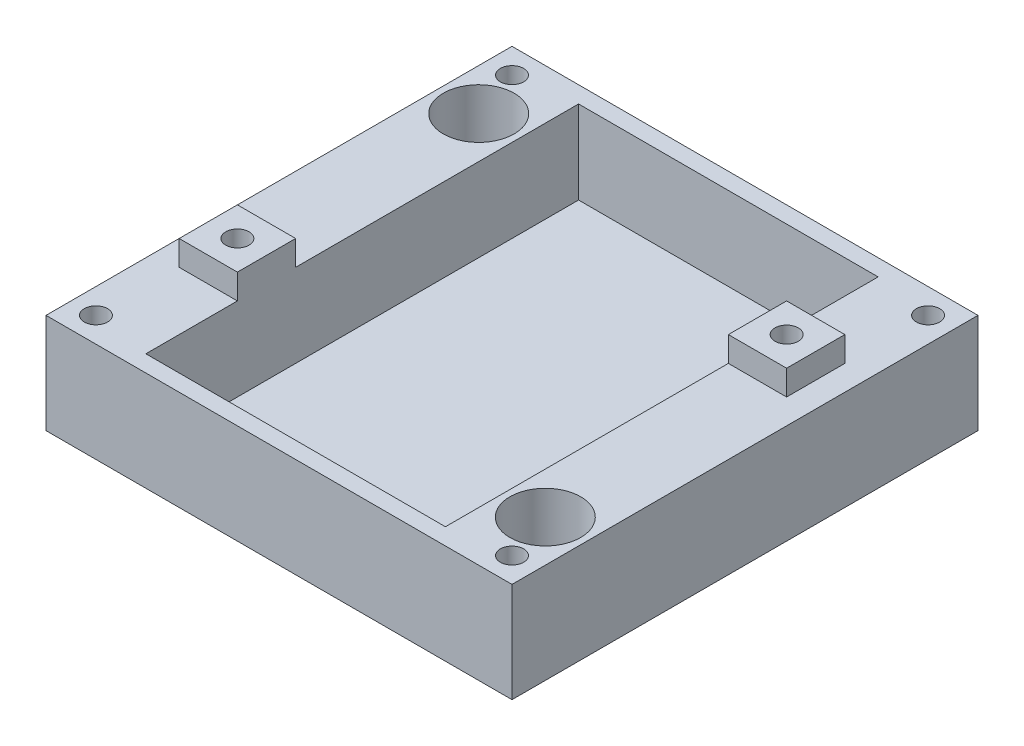
ISO-10303-21;
HEADER;
FILE_DESCRIPTION(('STEP AP214'),'2;1');
FILE_NAME('part.step','',(''),(''),'','','');
FILE_SCHEMA(('AUTOMOTIVE_DESIGN { 1 0 10303 214 1 1 1 1 }'));
ENDSEC;
DATA;
#1=APPLICATION_CONTEXT('core data for automotive mechanical design processes');
#2=APPLICATION_PROTOCOL_DEFINITION('international standard','automotive_design',2000,#1);
#3=PRODUCT_CONTEXT('',#1,'mechanical');
#4=PRODUCT('Part','Part','',(#3));
#5=PRODUCT_RELATED_PRODUCT_CATEGORY('part','',(#4));
#6=PRODUCT_DEFINITION_FORMATION('','',#4);
#7=PRODUCT_DEFINITION_CONTEXT('part definition',#1,'design');
#8=PRODUCT_DEFINITION('design','',#6,#7);
#9=PRODUCT_DEFINITION_SHAPE('','',#8);
#10=(LENGTH_UNIT() NAMED_UNIT(*) SI_UNIT(.MILLI.,.METRE.));
#11=(NAMED_UNIT(*) PLANE_ANGLE_UNIT() SI_UNIT($,.RADIAN.));
#12=(NAMED_UNIT(*) SI_UNIT($,.STERADIAN.) SOLID_ANGLE_UNIT());
#13=UNCERTAINTY_MEASURE_WITH_UNIT(LENGTH_MEASURE(1.E-05),#10,'distance_accuracy_value','');
#14=(GEOMETRIC_REPRESENTATION_CONTEXT(3) GLOBAL_UNCERTAINTY_ASSIGNED_CONTEXT((#13)) GLOBAL_UNIT_ASSIGNED_CONTEXT((#10,
#11,#12)) REPRESENTATION_CONTEXT('',''));
#15=CARTESIAN_POINT('',(0.,0.,0.));
#16=DIRECTION('',(0.,0.,1.));
#17=DIRECTION('',(1.,0.,0.));
#18=AXIS2_PLACEMENT_3D('',#15,#16,#17);
#19=CARTESIAN_POINT('',(23.,0.,19.));
#20=DIRECTION('',(0.,1.,0.));
#21=DIRECTION('',(0.,0.,1.));
#22=AXIS2_PLACEMENT_3D('',#19,#20,#21);
#23=CYLINDRICAL_SURFACE('',#22,2.25);
#24=CARTESIAN_POINT('',(23.,1.49999999999999,19.));
#25=DIRECTION('',(0.,1.,0.));
#26=DIRECTION('',(0.,0.,1.));
#27=AXIS2_PLACEMENT_3D('',#24,#25,#26);
#28=CIRCLE('',#27,2.25);
#29=CARTESIAN_POINT('',(23.,1.49999999999999,21.25));
#30=VERTEX_POINT('',#29);
#31=EDGE_CURVE('E43',#30,#30,#28,.T.);
#32=ORIENTED_EDGE('',*,*,#31,.T.);
#33=EDGE_LOOP('',(#32));
#34=FACE_BOUND('',#33,.T.);
#35=CARTESIAN_POINT('',(23.,0.,19.));
#36=DIRECTION('',(0.,1.,0.));
#37=DIRECTION('',(0.,0.,1.));
#38=AXIS2_PLACEMENT_3D('',#35,#36,#37);
#39=CIRCLE('',#38,2.25);
#40=CARTESIAN_POINT('',(23.,0.,21.25));
#41=VERTEX_POINT('',#40);
#42=EDGE_CURVE('E295',#41,#41,#39,.T.);
#43=ORIENTED_EDGE('',*,*,#42,.F.);
#44=EDGE_LOOP('',(#43));
#45=FACE_BOUND('',#44,.T.);
#46=ADVANCED_FACE('F35',(#34,#45),#23,.F.);
#47=CARTESIAN_POINT('',(-23.,0.,-19.));
#48=DIRECTION('',(0.,1.,0.));
#49=DIRECTION('',(0.,0.,1.));
#50=AXIS2_PLACEMENT_3D('',#47,#48,#49);
#51=CYLINDRICAL_SURFACE('',#50,2.25);
#52=CARTESIAN_POINT('',(-23.,1.49999999999999,-19.));
#53=DIRECTION('',(0.,1.,0.));
#54=DIRECTION('',(0.,0.,1.));
#55=AXIS2_PLACEMENT_3D('',#52,#53,#54);
#56=CIRCLE('',#55,2.25);
#57=CARTESIAN_POINT('',(-23.,1.49999999999999,-16.75));
#58=VERTEX_POINT('',#57);
#59=EDGE_CURVE('E11',#58,#58,#56,.T.);
#60=ORIENTED_EDGE('',*,*,#59,.T.);
#61=EDGE_LOOP('',(#60));
#62=FACE_BOUND('',#61,.T.);
#63=CARTESIAN_POINT('',(-23.,0.,-19.));
#64=DIRECTION('',(0.,1.,0.));
#65=DIRECTION('',(0.,0.,1.));
#66=AXIS2_PLACEMENT_3D('',#63,#64,#65);
#67=CIRCLE('',#66,2.25);
#68=CARTESIAN_POINT('',(-23.,0.,-16.75));
#69=VERTEX_POINT('',#68);
#70=EDGE_CURVE('E291',#69,#69,#67,.T.);
#71=ORIENTED_EDGE('',*,*,#70,.F.);
#72=EDGE_LOOP('',(#71));
#73=FACE_BOUND('',#72,.T.);
#74=ADVANCED_FACE('F359',(#62,#73),#51,.F.);
#75=CARTESIAN_POINT('',(0.,12.,0.));
#76=DIRECTION('',(0.,1.,0.));
#77=DIRECTION('',(0.,0.,1.));
#78=AXIS2_PLACEMENT_3D('',#75,#76,#77);
#79=PLANE('',#78);
#80=CARTESIAN_POINT('',(25.,12.,-25.));
#81=DIRECTION('',(0.,1.,0.));
#82=DIRECTION('',(0.,0.,1.));
#83=AXIS2_PLACEMENT_3D('',#80,#81,#82);
#84=CIRCLE('',#83,1.4);
#85=CARTESIAN_POINT('',(25.,12.,-23.6));
#86=VERTEX_POINT('',#85);
#87=EDGE_CURVE('E586',#86,#86,#84,.T.);
#88=ORIENTED_EDGE('',*,*,#87,.F.);
#89=EDGE_LOOP('',(#88));
#90=FACE_BOUND('',#89,.T.);
#91=CARTESIAN_POINT('',(-25.,12.,25.));
#92=DIRECTION('',(0.,1.,0.));
#93=DIRECTION('',(0.,0.,1.));
#94=AXIS2_PLACEMENT_3D('',#91,#92,#93);
#95=CIRCLE('',#94,1.4);
#96=CARTESIAN_POINT('',(-25.,12.,26.4));
#97=VERTEX_POINT('',#96);
#98=EDGE_CURVE('E585',#97,#97,#95,.T.);
#99=ORIENTED_EDGE('',*,*,#98,.F.);
#100=EDGE_LOOP('',(#99));
#101=FACE_BOUND('',#100,.T.);
#102=CARTESIAN_POINT('',(25.,12.,25.));
#103=DIRECTION('',(0.,1.,0.));
#104=DIRECTION('',(0.,0.,1.));
#105=AXIS2_PLACEMENT_3D('',#102,#103,#104);
#106=CIRCLE('',#105,1.4);
#107=CARTESIAN_POINT('',(25.,12.,26.4));
#108=VERTEX_POINT('',#107);
#109=EDGE_CURVE('E737',#108,#108,#106,.T.);
#110=ORIENTED_EDGE('',*,*,#109,.F.);
#111=EDGE_LOOP('',(#110));
#112=FACE_BOUND('',#111,.T.);
#113=CARTESIAN_POINT('',(-25.,12.,-25.));
#114=DIRECTION('',(0.,1.,0.));
#115=DIRECTION('',(0.,0.,1.));
#116=AXIS2_PLACEMENT_3D('',#113,#114,#115);
#117=CIRCLE('',#116,1.4);
#118=CARTESIAN_POINT('',(-25.,12.,-23.6));
#119=VERTEX_POINT('',#118);
#120=EDGE_CURVE('E597',#119,#119,#117,.T.);
#121=ORIENTED_EDGE('',*,*,#120,.F.);
#122=EDGE_LOOP('',(#121));
#123=FACE_BOUND('',#122,.T.);
#124=CARTESIAN_POINT('',(-23.,12.,-19.));
#125=DIRECTION('',(0.,1.,0.));
#126=DIRECTION('',(0.,0.,1.));
#127=AXIS2_PLACEMENT_3D('',#124,#125,#126);
#128=CIRCLE('',#127,4.25);
#129=CARTESIAN_POINT('',(-23.,12.,-14.75));
#130=VERTEX_POINT('',#129);
#131=EDGE_CURVE('E280',#130,#130,#128,.T.);
#132=ORIENTED_EDGE('',*,*,#131,.F.);
#133=EDGE_LOOP('',(#132));
#134=FACE_BOUND('',#133,.T.);
#135=CARTESIAN_POINT('',(23.,12.,19.));
#136=DIRECTION('',(0.,1.,0.));
#137=DIRECTION('',(0.,0.,1.));
#138=AXIS2_PLACEMENT_3D('',#135,#136,#137);
#139=CIRCLE('',#138,4.25);
#140=CARTESIAN_POINT('',(23.,12.,23.25));
#141=VERTEX_POINT('',#140);
#142=EDGE_CURVE('E281',#141,#141,#139,.T.);
#143=ORIENTED_EDGE('',*,*,#142,.F.);
#144=EDGE_LOOP('',(#143));
#145=FACE_BOUND('',#144,.T.);
#146=DIRECTION('',(0.,0.,1.));
#147=VECTOR('',#146,1.);
#148=CARTESIAN_POINT('',(-28.,12.,28.));
#149=LINE('',#148,#147);
#150=CARTESIAN_POINT('',(-28.,12.,-28.));
#151=VERTEX_POINT('',#150);
#152=CARTESIAN_POINT('',(-28.,12.,28.));
#153=VERTEX_POINT('',#152);
#154=EDGE_CURVE('E239',#151,#153,#149,.T.);
#155=ORIENTED_EDGE('',*,*,#154,.T.);
#156=DIRECTION('',(1.,0.,0.));
#157=VECTOR('',#156,1.);
#158=CARTESIAN_POINT('',(28.,12.,28.));
#159=LINE('',#158,#157);
#160=CARTESIAN_POINT('',(28.,12.,28.));
#161=VERTEX_POINT('',#160);
#162=EDGE_CURVE('E242',#153,#161,#159,.T.);
#163=ORIENTED_EDGE('',*,*,#162,.T.);
#164=DIRECTION('',(0.,0.,-1.));
#165=VECTOR('',#164,1.);
#166=CARTESIAN_POINT('',(28.,12.,28.));
#167=LINE('',#166,#165);
#168=CARTESIAN_POINT('',(28.,12.,-28.));
#169=VERTEX_POINT('',#168);
#170=EDGE_CURVE('E245',#161,#169,#167,.T.);
#171=ORIENTED_EDGE('',*,*,#170,.T.);
#172=DIRECTION('',(-1.,0.,0.));
#173=VECTOR('',#172,1.);
#174=CARTESIAN_POINT('',(28.,12.,-28.));
#175=LINE('',#174,#173);
#176=EDGE_CURVE('E247',#169,#151,#175,.T.);
#177=ORIENTED_EDGE('',*,*,#176,.T.);
#178=EDGE_LOOP('',(#155,#163,#171,#177));
#179=FACE_BOUND('',#178,.T.);
#180=DIRECTION('',(0.,0.,-1.));
#181=VECTOR('',#180,1.);
#182=CARTESIAN_POINT('',(18.,12.,-26.));
#183=LINE('',#182,#181);
#184=CARTESIAN_POINT('',(18.,12.,-15.));
#185=VERTEX_POINT('',#184);
#186=CARTESIAN_POINT('',(18.,12.,-26.));
#187=VERTEX_POINT('',#186);
#188=EDGE_CURVE('E202',#185,#187,#183,.T.);
#189=ORIENTED_EDGE('',*,*,#188,.F.);
#190=DIRECTION('',(-1.,0.,0.));
#191=VECTOR('',#190,1.);
#192=CARTESIAN_POINT('',(18.,12.,-15.));
#193=LINE('',#192,#191);
#194=CARTESIAN_POINT('',(25.,12.,-15.));
#195=VERTEX_POINT('',#194);
#196=EDGE_CURVE('E313',#195,#185,#193,.T.);
#197=ORIENTED_EDGE('',*,*,#196,.F.);
#198=DIRECTION('',(0.,0.,-1.));
#199=VECTOR('',#198,1.);
#200=CARTESIAN_POINT('',(25.,12.,-15.));
#201=LINE('',#200,#199);
#202=CARTESIAN_POINT('',(25.,12.,-8.));
#203=VERTEX_POINT('',#202);
#204=EDGE_CURVE('E168',#203,#195,#201,.T.);
#205=ORIENTED_EDGE('',*,*,#204,.F.);
#206=DIRECTION('',(1.,0.,0.));
#207=VECTOR('',#206,1.);
#208=CARTESIAN_POINT('',(18.,12.,-8.));
#209=LINE('',#208,#207);
#210=CARTESIAN_POINT('',(18.,12.,-8.));
#211=VERTEX_POINT('',#210);
#212=EDGE_CURVE('E164',#211,#203,#209,.T.);
#213=ORIENTED_EDGE('',*,*,#212,.F.);
#214=CARTESIAN_POINT('',(18.,12.,26.));
#215=VERTEX_POINT('',#214);
#216=EDGE_CURVE('E217',#215,#211,#183,.T.);
#217=ORIENTED_EDGE('',*,*,#216,.F.);
#218=DIRECTION('',(1.,0.,0.));
#219=VECTOR('',#218,1.);
#220=CARTESIAN_POINT('',(-18.,12.,26.));
#221=LINE('',#220,#219);
#222=CARTESIAN_POINT('',(-18.,12.,26.));
#223=VERTEX_POINT('',#222);
#224=EDGE_CURVE('E207',#223,#215,#221,.T.);
#225=ORIENTED_EDGE('',*,*,#224,.F.);
#226=DIRECTION('',(0.,0.,1.));
#227=VECTOR('',#226,1.);
#228=CARTESIAN_POINT('',(-18.,12.,-26.));
#229=LINE('',#228,#227);
#230=CARTESIAN_POINT('',(-18.,12.,15.));
#231=VERTEX_POINT('',#230);
#232=EDGE_CURVE('E223',#231,#223,#229,.T.);
#233=ORIENTED_EDGE('',*,*,#232,.F.);
#234=DIRECTION('',(1.,0.,0.));
#235=VECTOR('',#234,1.);
#236=CARTESIAN_POINT('',(-25.,12.,15.));
#237=LINE('',#236,#235);
#238=CARTESIAN_POINT('',(-25.,12.,15.));
#239=VERTEX_POINT('',#238);
#240=EDGE_CURVE('E58',#239,#231,#237,.T.);
#241=ORIENTED_EDGE('',*,*,#240,.F.);
#242=DIRECTION('',(0.,0.,1.));
#243=VECTOR('',#242,1.);
#244=CARTESIAN_POINT('',(-25.,12.,8.00000000000001));
#245=LINE('',#244,#243);
#246=CARTESIAN_POINT('',(-25.,12.,8.00000000000001));
#247=VERTEX_POINT('',#246);
#248=EDGE_CURVE('E173',#247,#239,#245,.T.);
#249=ORIENTED_EDGE('',*,*,#248,.F.);
#250=DIRECTION('',(-1.,0.,0.));
#251=VECTOR('',#250,1.);
#252=CARTESIAN_POINT('',(-25.,12.,8.00000000000001));
#253=LINE('',#252,#251);
#254=CARTESIAN_POINT('',(-18.,12.,7.99999999999999));
#255=VERTEX_POINT('',#254);
#256=EDGE_CURVE('E170',#255,#247,#253,.T.);
#257=ORIENTED_EDGE('',*,*,#256,.F.);
#258=CARTESIAN_POINT('',(-18.,12.,-26.));
#259=VERTEX_POINT('',#258);
#260=EDGE_CURVE('E224',#259,#255,#229,.T.);
#261=ORIENTED_EDGE('',*,*,#260,.F.);
#262=DIRECTION('',(-1.,0.,0.));
#263=VECTOR('',#262,1.);
#264=CARTESIAN_POINT('',(-18.,12.,-26.));
#265=LINE('',#264,#263);
#266=EDGE_CURVE('E220',#187,#259,#265,.T.);
#267=ORIENTED_EDGE('',*,*,#266,.F.);
#268=EDGE_LOOP('',(#189,#197,#205,#213,#217,#225,#233,#241,#249,#257,#261,#267));
#269=FACE_BOUND('',#268,.T.);
#270=ADVANCED_FACE('F322',(#90,#101,#112,#123,#134,#145,#179,#269),#79,.T.);
#271=CARTESIAN_POINT('',(-28.,12.,28.));
#272=DIRECTION('',(1.,0.,0.));
#273=DIRECTION('',(0.,0.,-1.));
#274=AXIS2_PLACEMENT_3D('',#271,#272,#273);
#275=PLANE('',#274);
#276=DIRECTION('',(0.,0.,1.));
#277=VECTOR('',#276,1.);
#278=CARTESIAN_POINT('',(-28.,0.,28.));
#279=LINE('',#278,#277);
#280=CARTESIAN_POINT('',(-28.,0.,-28.));
#281=VERTEX_POINT('',#280);
#282=CARTESIAN_POINT('',(-28.,0.,28.));
#283=VERTEX_POINT('',#282);
#284=EDGE_CURVE('E231',#281,#283,#279,.T.);
#285=ORIENTED_EDGE('',*,*,#284,.T.);
#286=DIRECTION('',(0.,-1.,0.));
#287=VECTOR('',#286,1.);
#288=CARTESIAN_POINT('',(-28.,12.,28.));
#289=LINE('',#288,#287);
#290=EDGE_CURVE('E265',#153,#283,#289,.T.);
#291=ORIENTED_EDGE('',*,*,#290,.F.);
#292=ORIENTED_EDGE('',*,*,#154,.F.);
#293=DIRECTION('',(0.,-1.,0.));
#294=VECTOR('',#293,1.);
#295=CARTESIAN_POINT('',(-28.,12.,-28.));
#296=LINE('',#295,#294);
#297=EDGE_CURVE('E249',#151,#281,#296,.T.);
#298=ORIENTED_EDGE('',*,*,#297,.T.);
#299=EDGE_LOOP('',(#285,#291,#292,#298));
#300=FACE_BOUND('',#299,.T.);
#301=ADVANCED_FACE('F500',(#300),#275,.F.);
#302=CARTESIAN_POINT('',(28.,12.,28.));
#303=DIRECTION('',(0.,0.,-1.));
#304=DIRECTION('',(-1.,0.,0.));
#305=AXIS2_PLACEMENT_3D('',#302,#303,#304);
#306=PLANE('',#305);
#307=DIRECTION('',(1.,0.,0.));
#308=VECTOR('',#307,1.);
#309=CARTESIAN_POINT('',(28.,0.,28.));
#310=LINE('',#309,#308);
#311=CARTESIAN_POINT('',(28.,0.,28.));
#312=VERTEX_POINT('',#311);
#313=EDGE_CURVE('E252',#283,#312,#310,.T.);
#314=ORIENTED_EDGE('',*,*,#313,.T.);
#315=DIRECTION('',(0.,-1.,0.));
#316=VECTOR('',#315,1.);
#317=CARTESIAN_POINT('',(28.,12.,28.));
#318=LINE('',#317,#316);
#319=EDGE_CURVE('E262',#161,#312,#318,.T.);
#320=ORIENTED_EDGE('',*,*,#319,.F.);
#321=ORIENTED_EDGE('',*,*,#162,.F.);
#322=ORIENTED_EDGE('',*,*,#290,.T.);
#323=EDGE_LOOP('',(#314,#320,#321,#322));
#324=FACE_BOUND('',#323,.T.);
#325=ADVANCED_FACE('F617',(#324),#306,.F.);
#326=CARTESIAN_POINT('',(28.,12.,28.));
#327=DIRECTION('',(-1.,0.,0.));
#328=DIRECTION('',(0.,0.,1.));
#329=AXIS2_PLACEMENT_3D('',#326,#327,#328);
#330=PLANE('',#329);
#331=DIRECTION('',(0.,0.,-1.));
#332=VECTOR('',#331,1.);
#333=CARTESIAN_POINT('',(28.,0.,28.));
#334=LINE('',#333,#332);
#335=CARTESIAN_POINT('',(28.,0.,-28.));
#336=VERTEX_POINT('',#335);
#337=EDGE_CURVE('E254',#312,#336,#334,.T.);
#338=ORIENTED_EDGE('',*,*,#337,.T.);
#339=DIRECTION('',(0.,-1.,0.));
#340=VECTOR('',#339,1.);
#341=CARTESIAN_POINT('',(28.,12.,-28.));
#342=LINE('',#341,#340);
#343=EDGE_CURVE('E259',#169,#336,#342,.T.);
#344=ORIENTED_EDGE('',*,*,#343,.F.);
#345=ORIENTED_EDGE('',*,*,#170,.F.);
#346=ORIENTED_EDGE('',*,*,#319,.T.);
#347=EDGE_LOOP('',(#338,#344,#345,#346));
#348=FACE_BOUND('',#347,.T.);
#349=ADVANCED_FACE('F622',(#348),#330,.F.);
#350=CARTESIAN_POINT('',(28.,12.,-28.));
#351=DIRECTION('',(0.,0.,1.));
#352=DIRECTION('',(1.,0.,0.));
#353=AXIS2_PLACEMENT_3D('',#350,#351,#352);
#354=PLANE('',#353);
#355=DIRECTION('',(-1.,0.,0.));
#356=VECTOR('',#355,1.);
#357=CARTESIAN_POINT('',(28.,0.,-28.));
#358=LINE('',#357,#356);
#359=EDGE_CURVE('E243',#336,#281,#358,.T.);
#360=ORIENTED_EDGE('',*,*,#359,.T.);
#361=ORIENTED_EDGE('',*,*,#297,.F.);
#362=ORIENTED_EDGE('',*,*,#176,.F.);
#363=ORIENTED_EDGE('',*,*,#343,.T.);
#364=EDGE_LOOP('',(#360,#361,#362,#363));
#365=FACE_BOUND('',#364,.T.);
#366=ADVANCED_FACE('F448',(#365),#354,.F.);
#367=CARTESIAN_POINT('',(0.,0.,0.));
#368=DIRECTION('',(0.,1.,0.));
#369=DIRECTION('',(0.,0.,1.));
#370=AXIS2_PLACEMENT_3D('',#367,#368,#369);
#371=PLANE('',#370);
#372=ORIENTED_EDGE('',*,*,#70,.T.);
#373=EDGE_LOOP('',(#372));
#374=FACE_BOUND('',#373,.T.);
#375=ORIENTED_EDGE('',*,*,#42,.T.);
#376=EDGE_LOOP('',(#375));
#377=FACE_BOUND('',#376,.T.);
#378=ORIENTED_EDGE('',*,*,#284,.F.);
#379=ORIENTED_EDGE('',*,*,#359,.F.);
#380=ORIENTED_EDGE('',*,*,#337,.F.);
#381=ORIENTED_EDGE('',*,*,#313,.F.);
#382=EDGE_LOOP('',(#378,#379,#380,#381));
#383=FACE_BOUND('',#382,.T.);
#384=ADVANCED_FACE('F444',(#374,#377,#383),#371,.F.);
#385=CARTESIAN_POINT('',(18.,2.,-26.));
#386=DIRECTION('',(1.,0.,0.));
#387=DIRECTION('',(0.,0.,-1.));
#388=AXIS2_PLACEMENT_3D('',#385,#386,#387);
#389=PLANE('',#388);
#390=ORIENTED_EDGE('',*,*,#216,.T.);
#391=DIRECTION('',(0.,-1.,0.));
#392=VECTOR('',#391,1.);
#393=CARTESIAN_POINT('',(18.,15.,-8.));
#394=LINE('',#393,#392);
#395=CARTESIAN_POINT('',(18.,15.,-8.));
#396=VERTEX_POINT('',#395);
#397=EDGE_CURVE('E175',#396,#211,#394,.T.);
#398=ORIENTED_EDGE('',*,*,#397,.F.);
#399=DIRECTION('',(0.,0.,1.));
#400=VECTOR('',#399,1.);
#401=CARTESIAN_POINT('',(18.,15.,-15.));
#402=LINE('',#401,#400);
#403=CARTESIAN_POINT('',(18.,15.,-15.));
#404=VERTEX_POINT('',#403);
#405=EDGE_CURVE('E154',#404,#396,#402,.T.);
#406=ORIENTED_EDGE('',*,*,#405,.F.);
#407=DIRECTION('',(0.,-1.,0.));
#408=VECTOR('',#407,1.);
#409=CARTESIAN_POINT('',(18.,15.,-15.));
#410=LINE('',#409,#408);
#411=EDGE_CURVE('E50',#404,#185,#410,.T.);
#412=ORIENTED_EDGE('',*,*,#411,.T.);
#413=ORIENTED_EDGE('',*,*,#188,.T.);
#414=DIRECTION('',(0.,1.,0.));
#415=VECTOR('',#414,1.);
#416=CARTESIAN_POINT('',(18.,2.,-26.));
#417=LINE('',#416,#415);
#418=CARTESIAN_POINT('',(18.,2.,-26.));
#419=VERTEX_POINT('',#418);
#420=EDGE_CURVE('E216',#419,#187,#417,.T.);
#421=ORIENTED_EDGE('',*,*,#420,.F.);
#422=DIRECTION('',(0.,0.,-1.));
#423=VECTOR('',#422,1.);
#424=CARTESIAN_POINT('',(18.,2.,-26.));
#425=LINE('',#424,#423);
#426=CARTESIAN_POINT('',(18.,2.,26.));
#427=VERTEX_POINT('',#426);
#428=EDGE_CURVE('E203',#427,#419,#425,.T.);
#429=ORIENTED_EDGE('',*,*,#428,.F.);
#430=DIRECTION('',(0.,1.,0.));
#431=VECTOR('',#430,1.);
#432=CARTESIAN_POINT('',(18.,2.,26.));
#433=LINE('',#432,#431);
#434=EDGE_CURVE('E229',#427,#215,#433,.T.);
#435=ORIENTED_EDGE('',*,*,#434,.T.);
#436=EDGE_LOOP('',(#390,#398,#406,#412,#413,#421,#429,#435));
#437=FACE_BOUND('',#436,.T.);
#438=ADVANCED_FACE('F324',(#437),#389,.F.);
#439=CARTESIAN_POINT('',(-18.,2.,26.));
#440=DIRECTION('',(0.,0.,1.));
#441=DIRECTION('',(1.,0.,0.));
#442=AXIS2_PLACEMENT_3D('',#439,#440,#441);
#443=PLANE('',#442);
#444=ORIENTED_EDGE('',*,*,#224,.T.);
#445=ORIENTED_EDGE('',*,*,#434,.F.);
#446=DIRECTION('',(1.,0.,0.));
#447=VECTOR('',#446,1.);
#448=CARTESIAN_POINT('',(-18.,2.,26.));
#449=LINE('',#448,#447);
#450=CARTESIAN_POINT('',(-18.,2.,26.));
#451=VERTEX_POINT('',#450);
#452=EDGE_CURVE('E213',#451,#427,#449,.T.);
#453=ORIENTED_EDGE('',*,*,#452,.F.);
#454=DIRECTION('',(0.,1.,0.));
#455=VECTOR('',#454,1.);
#456=CARTESIAN_POINT('',(-18.,2.,26.));
#457=LINE('',#456,#455);
#458=EDGE_CURVE('E232',#451,#223,#457,.T.);
#459=ORIENTED_EDGE('',*,*,#458,.T.);
#460=EDGE_LOOP('',(#444,#445,#453,#459));
#461=FACE_BOUND('',#460,.T.);
#462=ADVANCED_FACE('F328',(#461),#443,.F.);
#463=CARTESIAN_POINT('',(-18.,2.,-26.));
#464=DIRECTION('',(-1.,0.,0.));
#465=DIRECTION('',(0.,0.,1.));
#466=AXIS2_PLACEMENT_3D('',#463,#464,#465);
#467=PLANE('',#466);
#468=ORIENTED_EDGE('',*,*,#260,.T.);
#469=DIRECTION('',(0.,-1.,0.));
#470=VECTOR('',#469,1.);
#471=CARTESIAN_POINT('',(-18.,15.,8.));
#472=LINE('',#471,#470);
#473=CARTESIAN_POINT('',(-18.,15.,8.));
#474=VERTEX_POINT('',#473);
#475=EDGE_CURVE('E199',#474,#255,#472,.T.);
#476=ORIENTED_EDGE('',*,*,#475,.F.);
#477=DIRECTION('',(0.,0.,-1.));
#478=VECTOR('',#477,1.);
#479=CARTESIAN_POINT('',(-18.,15.,8.));
#480=LINE('',#479,#478);
#481=CARTESIAN_POINT('',(-18.,15.,15.));
#482=VERTEX_POINT('',#481);
#483=EDGE_CURVE('E179',#482,#474,#480,.T.);
#484=ORIENTED_EDGE('',*,*,#483,.F.);
#485=DIRECTION('',(0.,-1.,0.));
#486=VECTOR('',#485,1.);
#487=CARTESIAN_POINT('',(-18.,15.,15.));
#488=LINE('',#487,#486);
#489=EDGE_CURVE('E187',#482,#231,#488,.T.);
#490=ORIENTED_EDGE('',*,*,#489,.T.);
#491=ORIENTED_EDGE('',*,*,#232,.T.);
#492=ORIENTED_EDGE('',*,*,#458,.F.);
#493=DIRECTION('',(0.,0.,1.));
#494=VECTOR('',#493,1.);
#495=CARTESIAN_POINT('',(-18.,2.,-26.));
#496=LINE('',#495,#494);
#497=CARTESIAN_POINT('',(-18.,2.,-26.));
#498=VERTEX_POINT('',#497);
#499=EDGE_CURVE('E210',#498,#451,#496,.T.);
#500=ORIENTED_EDGE('',*,*,#499,.F.);
#501=DIRECTION('',(0.,1.,0.));
#502=VECTOR('',#501,1.);
#503=CARTESIAN_POINT('',(-18.,2.,-26.));
#504=LINE('',#503,#502);
#505=EDGE_CURVE('E235',#498,#259,#504,.T.);
#506=ORIENTED_EDGE('',*,*,#505,.T.);
#507=EDGE_LOOP('',(#468,#476,#484,#490,#491,#492,#500,#506));
#508=FACE_BOUND('',#507,.T.);
#509=ADVANCED_FACE('F336',(#508),#467,.F.);
#510=CARTESIAN_POINT('',(-18.,2.,-26.));
#511=DIRECTION('',(0.,0.,-1.));
#512=DIRECTION('',(-1.,0.,0.));
#513=AXIS2_PLACEMENT_3D('',#510,#511,#512);
#514=PLANE('',#513);
#515=ORIENTED_EDGE('',*,*,#266,.T.);
#516=ORIENTED_EDGE('',*,*,#505,.F.);
#517=DIRECTION('',(-1.,0.,0.));
#518=VECTOR('',#517,1.);
#519=CARTESIAN_POINT('',(-18.,2.,-26.));
#520=LINE('',#519,#518);
#521=EDGE_CURVE('E206',#419,#498,#520,.T.);
#522=ORIENTED_EDGE('',*,*,#521,.F.);
#523=ORIENTED_EDGE('',*,*,#420,.T.);
#524=EDGE_LOOP('',(#515,#516,#522,#523));
#525=FACE_BOUND('',#524,.T.);
#526=ADVANCED_FACE('F355',(#525),#514,.F.);
#527=CARTESIAN_POINT('',(0.,2.,0.));
#528=DIRECTION('',(0.,1.,0.));
#529=DIRECTION('',(0.,0.,1.));
#530=AXIS2_PLACEMENT_3D('',#527,#528,#529);
#531=PLANE('',#530);
#532=ORIENTED_EDGE('',*,*,#428,.T.);
#533=ORIENTED_EDGE('',*,*,#521,.T.);
#534=ORIENTED_EDGE('',*,*,#499,.T.);
#535=ORIENTED_EDGE('',*,*,#452,.T.);
#536=EDGE_LOOP('',(#532,#533,#534,#535));
#537=FACE_BOUND('',#536,.T.);
#538=ADVANCED_FACE('F348',(#537),#531,.T.);
#539=CARTESIAN_POINT('',(-25.,15.,8.00000000000001));
#540=DIRECTION('',(0.,0.,1.));
#541=DIRECTION('',(1.,0.,0.));
#542=AXIS2_PLACEMENT_3D('',#539,#540,#541);
#543=PLANE('',#542);
#544=ORIENTED_EDGE('',*,*,#256,.T.);
#545=DIRECTION('',(0.,-1.,0.));
#546=VECTOR('',#545,1.);
#547=CARTESIAN_POINT('',(-25.,15.,8.00000000000001));
#548=LINE('',#547,#546);
#549=CARTESIAN_POINT('',(-25.,15.,8.00000000000001));
#550=VERTEX_POINT('',#549);
#551=EDGE_CURVE('E196',#550,#247,#548,.T.);
#552=ORIENTED_EDGE('',*,*,#551,.F.);
#553=DIRECTION('',(-1.,0.,0.));
#554=VECTOR('',#553,1.);
#555=CARTESIAN_POINT('',(-25.,15.,8.00000000000001));
#556=LINE('',#555,#554);
#557=EDGE_CURVE('E182',#474,#550,#556,.T.);
#558=ORIENTED_EDGE('',*,*,#557,.F.);
#559=ORIENTED_EDGE('',*,*,#475,.T.);
#560=EDGE_LOOP('',(#544,#552,#558,#559));
#561=FACE_BOUND('',#560,.T.);
#562=ADVANCED_FACE('F346',(#561),#543,.F.);
#563=CARTESIAN_POINT('',(-25.,15.,8.00000000000001));
#564=DIRECTION('',(1.,0.,0.));
#565=DIRECTION('',(0.,0.,-1.));
#566=AXIS2_PLACEMENT_3D('',#563,#564,#565);
#567=PLANE('',#566);
#568=ORIENTED_EDGE('',*,*,#248,.T.);
#569=DIRECTION('',(0.,-1.,0.));
#570=VECTOR('',#569,1.);
#571=CARTESIAN_POINT('',(-25.,15.,15.));
#572=LINE('',#571,#570);
#573=CARTESIAN_POINT('',(-25.,15.,15.));
#574=VERTEX_POINT('',#573);
#575=EDGE_CURVE('E193',#574,#239,#572,.T.);
#576=ORIENTED_EDGE('',*,*,#575,.F.);
#577=DIRECTION('',(0.,0.,1.));
#578=VECTOR('',#577,1.);
#579=CARTESIAN_POINT('',(-25.,15.,8.00000000000001));
#580=LINE('',#579,#578);
#581=EDGE_CURVE('E184',#550,#574,#580,.T.);
#582=ORIENTED_EDGE('',*,*,#581,.F.);
#583=ORIENTED_EDGE('',*,*,#551,.T.);
#584=EDGE_LOOP('',(#568,#576,#582,#583));
#585=FACE_BOUND('',#584,.T.);
#586=ADVANCED_FACE('F343',(#585),#567,.F.);
#587=CARTESIAN_POINT('',(-25.,15.,15.));
#588=DIRECTION('',(0.,0.,-1.));
#589=DIRECTION('',(-1.,0.,0.));
#590=AXIS2_PLACEMENT_3D('',#587,#588,#589);
#591=PLANE('',#590);
#592=ORIENTED_EDGE('',*,*,#240,.T.);
#593=ORIENTED_EDGE('',*,*,#489,.F.);
#594=DIRECTION('',(1.,0.,0.));
#595=VECTOR('',#594,1.);
#596=CARTESIAN_POINT('',(-25.,15.,15.));
#597=LINE('',#596,#595);
#598=EDGE_CURVE('E186',#574,#482,#597,.T.);
#599=ORIENTED_EDGE('',*,*,#598,.F.);
#600=ORIENTED_EDGE('',*,*,#575,.T.);
#601=EDGE_LOOP('',(#592,#593,#599,#600));
#602=FACE_BOUND('',#601,.T.);
#603=ADVANCED_FACE('F332',(#602),#591,.F.);
#604=CARTESIAN_POINT('',(0.,15.,0.));
#605=DIRECTION('',(0.,1.,0.));
#606=DIRECTION('',(0.,0.,1.));
#607=AXIS2_PLACEMENT_3D('',#604,#605,#606);
#608=PLANE('',#607);
#609=CARTESIAN_POINT('',(-21.5,15.,11.5));
#610=DIRECTION('',(0.,1.,0.));
#611=DIRECTION('',(0.,0.,1.));
#612=AXIS2_PLACEMENT_3D('',#609,#610,#611);
#613=CIRCLE('',#612,1.4);
#614=CARTESIAN_POINT('',(-21.5,15.,12.9));
#615=VERTEX_POINT('',#614);
#616=EDGE_CURVE('E301',#615,#615,#613,.T.);
#617=ORIENTED_EDGE('',*,*,#616,.F.);
#618=EDGE_LOOP('',(#617));
#619=FACE_BOUND('',#618,.T.);
#620=ORIENTED_EDGE('',*,*,#483,.T.);
#621=ORIENTED_EDGE('',*,*,#557,.T.);
#622=ORIENTED_EDGE('',*,*,#581,.T.);
#623=ORIENTED_EDGE('',*,*,#598,.T.);
#624=EDGE_LOOP('',(#620,#621,#622,#623));
#625=FACE_BOUND('',#624,.T.);
#626=ADVANCED_FACE('F339',(#619,#625),#608,.T.);
#627=CARTESIAN_POINT('',(25.,15.,-15.));
#628=DIRECTION('',(-1.,0.,0.));
#629=DIRECTION('',(0.,0.,1.));
#630=AXIS2_PLACEMENT_3D('',#627,#628,#629);
#631=PLANE('',#630);
#632=ORIENTED_EDGE('',*,*,#204,.T.);
#633=DIRECTION('',(0.,-1.,0.));
#634=VECTOR('',#633,1.);
#635=CARTESIAN_POINT('',(25.,15.,-15.));
#636=LINE('',#635,#634);
#637=CARTESIAN_POINT('',(25.,15.,-15.));
#638=VERTEX_POINT('',#637);
#639=EDGE_CURVE('E151',#638,#195,#636,.T.);
#640=ORIENTED_EDGE('',*,*,#639,.F.);
#641=DIRECTION('',(0.,0.,-1.));
#642=VECTOR('',#641,1.);
#643=CARTESIAN_POINT('',(25.,15.,-15.));
#644=LINE('',#643,#642);
#645=CARTESIAN_POINT('',(25.,15.,-8.));
#646=VERTEX_POINT('',#645);
#647=EDGE_CURVE('E155',#646,#638,#644,.T.);
#648=ORIENTED_EDGE('',*,*,#647,.F.);
#649=DIRECTION('',(0.,-1.,0.));
#650=VECTOR('',#649,1.);
#651=CARTESIAN_POINT('',(25.,15.,-8.));
#652=LINE('',#651,#650);
#653=EDGE_CURVE('E311',#646,#203,#652,.T.);
#654=ORIENTED_EDGE('',*,*,#653,.T.);
#655=EDGE_LOOP('',(#632,#640,#648,#654));
#656=FACE_BOUND('',#655,.T.);
#657=ADVANCED_FACE('F166',(#656),#631,.F.);
#658=CARTESIAN_POINT('',(18.,15.,-15.));
#659=DIRECTION('',(0.,0.,1.));
#660=DIRECTION('',(1.,0.,0.));
#661=AXIS2_PLACEMENT_3D('',#658,#659,#660);
#662=PLANE('',#661);
#663=ORIENTED_EDGE('',*,*,#196,.T.);
#664=ORIENTED_EDGE('',*,*,#411,.F.);
#665=DIRECTION('',(-1.,0.,0.));
#666=VECTOR('',#665,1.);
#667=CARTESIAN_POINT('',(18.,15.,-15.));
#668=LINE('',#667,#666);
#669=EDGE_CURVE('E147',#638,#404,#668,.T.);
#670=ORIENTED_EDGE('',*,*,#669,.F.);
#671=ORIENTED_EDGE('',*,*,#639,.T.);
#672=EDGE_LOOP('',(#663,#664,#670,#671));
#673=FACE_BOUND('',#672,.T.);
#674=ADVANCED_FACE('F149',(#673),#662,.F.);
#675=CARTESIAN_POINT('',(18.,15.,-8.));
#676=DIRECTION('',(0.,0.,-1.));
#677=DIRECTION('',(-1.,0.,0.));
#678=AXIS2_PLACEMENT_3D('',#675,#676,#677);
#679=PLANE('',#678);
#680=ORIENTED_EDGE('',*,*,#212,.T.);
#681=ORIENTED_EDGE('',*,*,#653,.F.);
#682=DIRECTION('',(1.,0.,0.));
#683=VECTOR('',#682,1.);
#684=CARTESIAN_POINT('',(18.,15.,-8.));
#685=LINE('',#684,#683);
#686=EDGE_CURVE('E160',#396,#646,#685,.T.);
#687=ORIENTED_EDGE('',*,*,#686,.F.);
#688=ORIENTED_EDGE('',*,*,#397,.T.);
#689=EDGE_LOOP('',(#680,#681,#687,#688));
#690=FACE_BOUND('',#689,.T.);
#691=ADVANCED_FACE('F319',(#690),#679,.F.);
#692=CARTESIAN_POINT('',(0.,15.,0.));
#693=DIRECTION('',(0.,1.,0.));
#694=DIRECTION('',(0.,0.,1.));
#695=AXIS2_PLACEMENT_3D('',#692,#693,#694);
#696=PLANE('',#695);
#697=CARTESIAN_POINT('',(21.5,15.,-11.5));
#698=DIRECTION('',(0.,1.,0.));
#699=DIRECTION('',(0.,0.,1.));
#700=AXIS2_PLACEMENT_3D('',#697,#698,#699);
#701=CIRCLE('',#700,1.4);
#702=CARTESIAN_POINT('',(21.5,15.,-10.1));
#703=VERTEX_POINT('',#702);
#704=EDGE_CURVE('E294',#703,#703,#701,.T.);
#705=ORIENTED_EDGE('',*,*,#704,.F.);
#706=EDGE_LOOP('',(#705));
#707=FACE_BOUND('',#706,.T.);
#708=ORIENTED_EDGE('',*,*,#647,.T.);
#709=ORIENTED_EDGE('',*,*,#669,.T.);
#710=ORIENTED_EDGE('',*,*,#405,.T.);
#711=ORIENTED_EDGE('',*,*,#686,.T.);
#712=EDGE_LOOP('',(#708,#709,#710,#711));
#713=FACE_BOUND('',#712,.T.);
#714=ADVANCED_FACE('F158',(#707,#713),#696,.T.);
#715=CARTESIAN_POINT('',(21.5,7.,-11.5));
#716=DIRECTION('',(0.,1.,0.));
#717=DIRECTION('',(0.,0.,1.));
#718=AXIS2_PLACEMENT_3D('',#715,#716,#717);
#719=CYLINDRICAL_SURFACE('',#718,1.4);
#720=CARTESIAN_POINT('',(21.5,7.,-11.5));
#721=DIRECTION('',(0.,1.,0.));
#722=DIRECTION('',(0.,0.,1.));
#723=AXIS2_PLACEMENT_3D('',#720,#721,#722);
#724=CIRCLE('',#723,1.4);
#725=CARTESIAN_POINT('',(21.5,7.,-10.1));
#726=VERTEX_POINT('',#725);
#727=EDGE_CURVE('E304',#726,#726,#724,.T.);
#728=ORIENTED_EDGE('',*,*,#727,.F.);
#729=EDGE_LOOP('',(#728));
#730=FACE_BOUND('',#729,.T.);
#731=ORIENTED_EDGE('',*,*,#704,.T.);
#732=EDGE_LOOP('',(#731));
#733=FACE_BOUND('',#732,.T.);
#734=ADVANCED_FACE('F380',(#730,#733),#719,.F.);
#735=CARTESIAN_POINT('',(21.5,7.,-11.5));
#736=DIRECTION('',(0.,1.,0.));
#737=DIRECTION('',(0.,0.,1.));
#738=AXIS2_PLACEMENT_3D('',#735,#736,#737);
#739=PLANE('',#738);
#740=ORIENTED_EDGE('',*,*,#727,.T.);
#741=EDGE_LOOP('',(#740));
#742=FACE_BOUND('',#741,.T.);
#743=ADVANCED_FACE('F376',(#742),#739,.T.);
#744=CARTESIAN_POINT('',(-21.5,7.,11.5));
#745=DIRECTION('',(0.,1.,0.));
#746=DIRECTION('',(0.,0.,1.));
#747=AXIS2_PLACEMENT_3D('',#744,#745,#746);
#748=CYLINDRICAL_SURFACE('',#747,1.4);
#749=CARTESIAN_POINT('',(-21.5,7.,11.5));
#750=DIRECTION('',(0.,1.,0.));
#751=DIRECTION('',(0.,0.,1.));
#752=AXIS2_PLACEMENT_3D('',#749,#750,#751);
#753=CIRCLE('',#752,1.4);
#754=CARTESIAN_POINT('',(-21.5,7.,12.9));
#755=VERTEX_POINT('',#754);
#756=EDGE_CURVE('E298',#755,#755,#753,.T.);
#757=ORIENTED_EDGE('',*,*,#756,.F.);
#758=EDGE_LOOP('',(#757));
#759=FACE_BOUND('',#758,.T.);
#760=ORIENTED_EDGE('',*,*,#616,.T.);
#761=EDGE_LOOP('',(#760));
#762=FACE_BOUND('',#761,.T.);
#763=ADVANCED_FACE('F372',(#759,#762),#748,.F.);
#764=CARTESIAN_POINT('',(-21.5,7.,11.5));
#765=DIRECTION('',(0.,1.,0.));
#766=DIRECTION('',(0.,0.,1.));
#767=AXIS2_PLACEMENT_3D('',#764,#765,#766);
#768=PLANE('',#767);
#769=ORIENTED_EDGE('',*,*,#756,.T.);
#770=EDGE_LOOP('',(#769));
#771=FACE_BOUND('',#770,.T.);
#772=ADVANCED_FACE('F369',(#771),#768,.T.);
#773=CARTESIAN_POINT('',(-23.,3.,-19.));
#774=DIRECTION('',(0.,1.,0.));
#775=DIRECTION('',(0.,0.,1.));
#776=AXIS2_PLACEMENT_3D('',#773,#774,#775);
#777=CYLINDRICAL_SURFACE('',#776,4.25);
#778=CARTESIAN_POINT('',(-23.,3.,-19.));
#779=DIRECTION('',(0.,1.,0.));
#780=DIRECTION('',(0.,0.,1.));
#781=AXIS2_PLACEMENT_3D('',#778,#779,#780);
#782=CIRCLE('',#781,4.25);
#783=CARTESIAN_POINT('',(-23.,3.,-14.75));
#784=VERTEX_POINT('',#783);
#785=EDGE_CURVE('E284',#784,#784,#782,.T.);
#786=ORIENTED_EDGE('',*,*,#785,.F.);
#787=EDGE_LOOP('',(#786));
#788=FACE_BOUND('',#787,.T.);
#789=ORIENTED_EDGE('',*,*,#131,.T.);
#790=EDGE_LOOP('',(#789));
#791=FACE_BOUND('',#790,.T.);
#792=ADVANCED_FACE('F371',(#788,#791),#777,.F.);
#793=CARTESIAN_POINT('',(23.,3.,19.));
#794=DIRECTION('',(0.,1.,0.));
#795=DIRECTION('',(0.,0.,1.));
#796=AXIS2_PLACEMENT_3D('',#793,#794,#795);
#797=CYLINDRICAL_SURFACE('',#796,4.25);
#798=CARTESIAN_POINT('',(23.,3.,19.));
#799=DIRECTION('',(0.,1.,0.));
#800=DIRECTION('',(0.,0.,1.));
#801=AXIS2_PLACEMENT_3D('',#798,#799,#800);
#802=CIRCLE('',#801,4.25);
#803=CARTESIAN_POINT('',(23.,3.,23.25));
#804=VERTEX_POINT('',#803);
#805=EDGE_CURVE('E278',#804,#804,#802,.T.);
#806=ORIENTED_EDGE('',*,*,#805,.F.);
#807=EDGE_LOOP('',(#806));
#808=FACE_BOUND('',#807,.T.);
#809=ORIENTED_EDGE('',*,*,#142,.T.);
#810=EDGE_LOOP('',(#809));
#811=FACE_BOUND('',#810,.T.);
#812=ADVANCED_FACE('F275',(#808,#811),#797,.F.);
#813=CARTESIAN_POINT('',(23.,3.,19.));
#814=DIRECTION('',(0.,1.,0.));
#815=DIRECTION('',(0.,0.,1.));
#816=AXIS2_PLACEMENT_3D('',#813,#814,#815);
#817=CONICAL_SURFACE('',#816,4.25000000000002,0.927295218001614);
#818=ORIENTED_EDGE('',*,*,#31,.F.);
#819=EDGE_LOOP('',(#818));
#820=FACE_BOUND('',#819,.T.);
#821=ORIENTED_EDGE('',*,*,#805,.T.);
#822=EDGE_LOOP('',(#821));
#823=FACE_BOUND('',#822,.T.);
#824=ADVANCED_FACE('F272',(#820,#823),#817,.F.);
#825=CARTESIAN_POINT('',(-23.,3.,-19.));
#826=DIRECTION('',(0.,1.,0.));
#827=DIRECTION('',(0.,0.,1.));
#828=AXIS2_PLACEMENT_3D('',#825,#826,#827);
#829=CONICAL_SURFACE('',#828,4.25000000000002,0.927295218001614);
#830=CARTESIAN_POINT('',(-23.,1.49999999999999,-16.75));
#831=CARTESIAN_POINT('',(-23.,1.51562499999999,-16.7291666666667));
#832=CARTESIAN_POINT('',(-23.,1.53124999999999,-16.7083333333333));
#833=CARTESIAN_POINT('',(-23.,1.56249999999999,-16.6666666666667));
#834=CARTESIAN_POINT('',(-23.,1.57812499999999,-16.6458333333333));
#835=CARTESIAN_POINT('',(-23.,1.60937499999999,-16.6041666666667));
#836=CARTESIAN_POINT('',(-23.,1.62499999999999,-16.5833333333333));
#837=CARTESIAN_POINT('',(-23.,1.65624999999999,-16.5416666666667));
#838=CARTESIAN_POINT('',(-23.,1.67187499999999,-16.5208333333333));
#839=CARTESIAN_POINT('',(-23.,1.70312499999999,-16.4791666666667));
#840=CARTESIAN_POINT('',(-23.,1.71874999999999,-16.4583333333333));
#841=CARTESIAN_POINT('',(-23.,1.74999999999999,-16.4166666666667));
#842=CARTESIAN_POINT('',(-23.,1.76562499999999,-16.3958333333333));
#843=CARTESIAN_POINT('',(-23.,1.79687499999999,-16.3541666666667));
#844=CARTESIAN_POINT('',(-23.,1.81249999999999,-16.3333333333333));
#845=CARTESIAN_POINT('',(-23.,1.84374999999999,-16.2916666666667));
#846=CARTESIAN_POINT('',(-23.,1.85937499999999,-16.2708333333333));
#847=CARTESIAN_POINT('',(-23.,1.890625,-16.2291666666667));
#848=CARTESIAN_POINT('',(-23.,1.90625,-16.2083333333333));
#849=CARTESIAN_POINT('',(-23.,1.9375,-16.1666666666667));
#850=CARTESIAN_POINT('',(-23.,1.953125,-16.1458333333333));
#851=CARTESIAN_POINT('',(-23.,1.984375,-16.1041666666667));
#852=CARTESIAN_POINT('',(-23.,2.,-16.0833333333333));
#853=CARTESIAN_POINT('',(-23.,2.03125,-16.0416666666667));
#854=CARTESIAN_POINT('',(-23.,2.046875,-16.0208333333333));
#855=CARTESIAN_POINT('',(-23.,2.078125,-15.9791666666667));
#856=CARTESIAN_POINT('',(-23.,2.09375,-15.9583333333333));
#857=CARTESIAN_POINT('',(-23.,2.125,-15.9166666666667));
#858=CARTESIAN_POINT('',(-23.,2.140625,-15.8958333333333));
#859=CARTESIAN_POINT('',(-23.,2.171875,-15.8541666666667));
#860=CARTESIAN_POINT('',(-23.,2.1875,-15.8333333333333));
#861=CARTESIAN_POINT('',(-23.,2.21875,-15.7916666666667));
#862=CARTESIAN_POINT('',(-23.,2.234375,-15.7708333333333));
#863=CARTESIAN_POINT('',(-23.,2.265625,-15.7291666666667));
#864=CARTESIAN_POINT('',(-23.,2.28125,-15.7083333333333));
#865=CARTESIAN_POINT('',(-23.,2.3125,-15.6666666666667));
#866=CARTESIAN_POINT('',(-23.,2.328125,-15.6458333333333));
#867=CARTESIAN_POINT('',(-23.,2.359375,-15.6041666666667));
#868=CARTESIAN_POINT('',(-23.,2.375,-15.5833333333333));
#869=CARTESIAN_POINT('',(-23.,2.40625,-15.5416666666667));
#870=CARTESIAN_POINT('',(-23.,2.421875,-15.5208333333333));
#871=CARTESIAN_POINT('',(-23.,2.453125,-15.4791666666667));
#872=CARTESIAN_POINT('',(-23.,2.46875,-15.4583333333333));
#873=CARTESIAN_POINT('',(-23.,2.5,-15.4166666666667));
#874=CARTESIAN_POINT('',(-23.,2.515625,-15.3958333333333));
#875=CARTESIAN_POINT('',(-23.,2.546875,-15.3541666666667));
#876=CARTESIAN_POINT('',(-23.,2.5625,-15.3333333333333));
#877=CARTESIAN_POINT('',(-23.,2.59375,-15.2916666666667));
#878=CARTESIAN_POINT('',(-23.,2.609375,-15.2708333333333));
#879=CARTESIAN_POINT('',(-23.,2.640625,-15.2291666666667));
#880=CARTESIAN_POINT('',(-23.,2.65625,-15.2083333333333));
#881=CARTESIAN_POINT('',(-23.,2.6875,-15.1666666666667));
#882=CARTESIAN_POINT('',(-23.,2.703125,-15.1458333333333));
#883=CARTESIAN_POINT('',(-23.,2.734375,-15.1041666666667));
#884=CARTESIAN_POINT('',(-23.,2.75,-15.0833333333333));
#885=CARTESIAN_POINT('',(-23.,2.78125,-15.0416666666667));
#886=CARTESIAN_POINT('',(-23.,2.796875,-15.0208333333333));
#887=CARTESIAN_POINT('',(-23.,2.828125,-14.9791666666667));
#888=CARTESIAN_POINT('',(-23.,2.84375,-14.9583333333333));
#889=CARTESIAN_POINT('',(-23.,2.875,-14.9166666666667));
#890=CARTESIAN_POINT('',(-23.,2.890625,-14.8958333333333));
#891=CARTESIAN_POINT('',(-23.,2.921875,-14.8541666666667));
#892=CARTESIAN_POINT('',(-23.,2.9375,-14.8333333333333));
#893=CARTESIAN_POINT('',(-23.,2.96875,-14.7916666666666));
#894=CARTESIAN_POINT('',(-23.,2.984375,-14.7708333333333));
#895=CARTESIAN_POINT('',(-23.,3.,-14.75));
#896=B_SPLINE_CURVE_WITH_KNOTS('',3,(#830,#831,#832,#833,#834,#835,#836,#837,#838,#839,#840,
#841,#842,#843,#844,#845,#846,#847,#848,#849,#850,#851,#852,#853,#854,#855,#856,#857,#858,#859,
#860,#861,#862,#863,#864,#865,#866,#867,#868,#869,#870,#871,#872,#873,#874,#875,#876,#877,#878,
#879,#880,#881,#882,#883,#884,#885,#886,#887,#888,#889,#890,#891,#892,#893,#894,#895),
.UNSPECIFIED.,.F.,.F.,(4,2,2,2,2,2,2,2,2,2,2,2,2,2,2,2,2,2,2,2,2,2,2,2,2,2,2,2,2,2,2,2,4),(0.,
0.0781250000000002,0.15625,0.234375000000001,0.312500000000001,0.390625000000001,
0.468750000000004,0.546875000000004,0.625000000000004,0.703125000000004,0.781250000000007,
0.859375000000007,0.937500000000008,1.01562500000001,1.09375000000001,1.17187500000001,
1.25000000000001,1.32812500000001,1.40625000000001,1.48437500000001,1.56250000000001,
1.64062500000001,1.71875000000001,1.79687500000001,1.87500000000001,1.95312500000002,
2.03125000000002,2.10937500000002,2.18750000000002,2.26562500000002,2.34375000000002,
2.42187500000002,2.50000000000002),.UNSPECIFIED.);
#897=EDGE_CURVE('BSEAM37',#58,#784,#896,.T.);
#898=ORIENTED_EDGE('',*,*,#59,.F.);
#899=ORIENTED_EDGE('',*,*,#785,.T.);
#900=ORIENTED_EDGE('',*,*,#897,.T.);
#901=ORIENTED_EDGE('',*,*,#897,.F.);
#902=EDGE_LOOP('',(#898,#900,#899,#901));
#903=FACE_BOUND('',#902,.T.);
#904=ADVANCED_FACE('F37',(#903),#829,.F.);
#905=CARTESIAN_POINT('',(-25.,4.,-25.));
#906=DIRECTION('',(0.,1.,0.));
#907=DIRECTION('',(0.,0.,1.));
#908=AXIS2_PLACEMENT_3D('',#905,#906,#907);
#909=CYLINDRICAL_SURFACE('',#908,1.4);
#910=CARTESIAN_POINT('',(-25.,4.,-25.));
#911=DIRECTION('',(0.,1.,0.));
#912=DIRECTION('',(0.,0.,1.));
#913=AXIS2_PLACEMENT_3D('',#910,#911,#912);
#914=CIRCLE('',#913,1.4);
#915=CARTESIAN_POINT('',(-25.,4.,-23.6));
#916=VERTEX_POINT('',#915);
#917=EDGE_CURVE('E287',#916,#916,#914,.T.);
#918=ORIENTED_EDGE('',*,*,#917,.F.);
#919=EDGE_LOOP('',(#918));
#920=FACE_BOUND('',#919,.T.);
#921=ORIENTED_EDGE('',*,*,#120,.T.);
#922=EDGE_LOOP('',(#921));
#923=FACE_BOUND('',#922,.T.);
#924=ADVANCED_FACE('F490',(#920,#923),#909,.F.);
#925=CARTESIAN_POINT('',(-25.,4.,-25.));
#926=DIRECTION('',(0.,1.,0.));
#927=DIRECTION('',(0.,0.,1.));
#928=AXIS2_PLACEMENT_3D('',#925,#926,#927);
#929=PLANE('',#928);
#930=ORIENTED_EDGE('',*,*,#917,.T.);
#931=EDGE_LOOP('',(#930));
#932=FACE_BOUND('',#931,.T.);
#933=ADVANCED_FACE('F508',(#932),#929,.T.);
#934=CARTESIAN_POINT('',(25.,4.,25.));
#935=DIRECTION('',(0.,1.,0.));
#936=DIRECTION('',(0.,0.,1.));
#937=AXIS2_PLACEMENT_3D('',#934,#935,#936);
#938=CYLINDRICAL_SURFACE('',#937,1.4);
#939=CARTESIAN_POINT('',(25.,4.,25.));
#940=DIRECTION('',(0.,1.,0.));
#941=DIRECTION('',(0.,0.,1.));
#942=AXIS2_PLACEMENT_3D('',#939,#940,#941);
#943=CIRCLE('',#942,1.4);
#944=CARTESIAN_POINT('',(25.,4.,26.4));
#945=VERTEX_POINT('',#944);
#946=EDGE_CURVE('E599',#945,#945,#943,.T.);
#947=ORIENTED_EDGE('',*,*,#946,.F.);
#948=EDGE_LOOP('',(#947));
#949=FACE_BOUND('',#948,.T.);
#950=ORIENTED_EDGE('',*,*,#109,.T.);
#951=EDGE_LOOP('',(#950));
#952=FACE_BOUND('',#951,.T.);
#953=ADVANCED_FACE('F518',(#949,#952),#938,.F.);
#954=CARTESIAN_POINT('',(25.,4.,25.));
#955=DIRECTION('',(0.,1.,0.));
#956=DIRECTION('',(0.,0.,1.));
#957=AXIS2_PLACEMENT_3D('',#954,#955,#956);
#958=PLANE('',#957);
#959=ORIENTED_EDGE('',*,*,#946,.T.);
#960=EDGE_LOOP('',(#959));
#961=FACE_BOUND('',#960,.T.);
#962=ADVANCED_FACE('F528',(#961),#958,.T.);
#963=CARTESIAN_POINT('',(-25.,4.,25.));
#964=DIRECTION('',(0.,1.,0.));
#965=DIRECTION('',(0.,0.,1.));
#966=AXIS2_PLACEMENT_3D('',#963,#964,#965);
#967=CYLINDRICAL_SURFACE('',#966,1.4);
#968=CARTESIAN_POINT('',(-25.,4.,25.));
#969=DIRECTION('',(0.,1.,0.));
#970=DIRECTION('',(0.,0.,1.));
#971=AXIS2_PLACEMENT_3D('',#968,#969,#970);
#972=CIRCLE('',#971,1.4);
#973=CARTESIAN_POINT('',(-25.,4.,26.4));
#974=VERTEX_POINT('',#973);
#975=EDGE_CURVE('E589',#974,#974,#972,.T.);
#976=ORIENTED_EDGE('',*,*,#975,.F.);
#977=EDGE_LOOP('',(#976));
#978=FACE_BOUND('',#977,.T.);
#979=ORIENTED_EDGE('',*,*,#98,.T.);
#980=EDGE_LOOP('',(#979));
#981=FACE_BOUND('',#980,.T.);
#982=ADVANCED_FACE('F538',(#978,#981),#967,.F.);
#983=CARTESIAN_POINT('',(-25.,4.,25.));
#984=DIRECTION('',(0.,1.,0.));
#985=DIRECTION('',(0.,0.,1.));
#986=AXIS2_PLACEMENT_3D('',#983,#984,#985);
#987=PLANE('',#986);
#988=ORIENTED_EDGE('',*,*,#975,.T.);
#989=EDGE_LOOP('',(#988));
#990=FACE_BOUND('',#989,.T.);
#991=ADVANCED_FACE('F548',(#990),#987,.T.);
#992=CARTESIAN_POINT('',(25.,4.,-25.));
#993=DIRECTION('',(0.,1.,0.));
#994=DIRECTION('',(0.,0.,1.));
#995=AXIS2_PLACEMENT_3D('',#992,#993,#994);
#996=CYLINDRICAL_SURFACE('',#995,1.4);
#997=CARTESIAN_POINT('',(25.,4.,-25.));
#998=DIRECTION('',(0.,1.,0.));
#999=DIRECTION('',(0.,0.,1.));
#1000=AXIS2_PLACEMENT_3D('',#997,#998,#999);
#1001=CIRCLE('',#1000,1.4);
#1002=CARTESIAN_POINT('',(25.,4.,-23.6));
#1003=VERTEX_POINT('',#1002);
#1004=EDGE_CURVE('E584',#1003,#1003,#1001,.T.);
#1005=ORIENTED_EDGE('',*,*,#1004,.F.);
#1006=EDGE_LOOP('',(#1005));
#1007=FACE_BOUND('',#1006,.T.);
#1008=ORIENTED_EDGE('',*,*,#87,.T.);
#1009=EDGE_LOOP('',(#1008));
#1010=FACE_BOUND('',#1009,.T.);
#1011=ADVANCED_FACE('F558',(#1007,#1010),#996,.F.);
#1012=CARTESIAN_POINT('',(25.,4.,-25.));
#1013=DIRECTION('',(0.,1.,0.));
#1014=DIRECTION('',(0.,0.,1.));
#1015=AXIS2_PLACEMENT_3D('',#1012,#1013,#1014);
#1016=PLANE('',#1015);
#1017=ORIENTED_EDGE('',*,*,#1004,.T.);
#1018=EDGE_LOOP('',(#1017));
#1019=FACE_BOUND('',#1018,.T.);
#1020=ADVANCED_FACE('F568',(#1019),#1016,.T.);
#1021=CLOSED_SHELL('',(#46,#74,#270,#301,#325,#349,#366,#384,#438,#462,#509,#526,#538,#562,#586,
#603,#626,#657,#674,#691,#714,#734,#743,#763,#772,#792,#812,#824,#904,#924,#933,#953,#962,#982,
#991,#1011,#1020));
#1022=MANIFOLD_SOLID_BREP('B2',#1021);
#1023=ADVANCED_BREP_SHAPE_REPRESENTATION('',(#18,#1022),#14);
#1024=SHAPE_DEFINITION_REPRESENTATION(#9,#1023);
ENDSEC;
END-ISO-10303-21;
